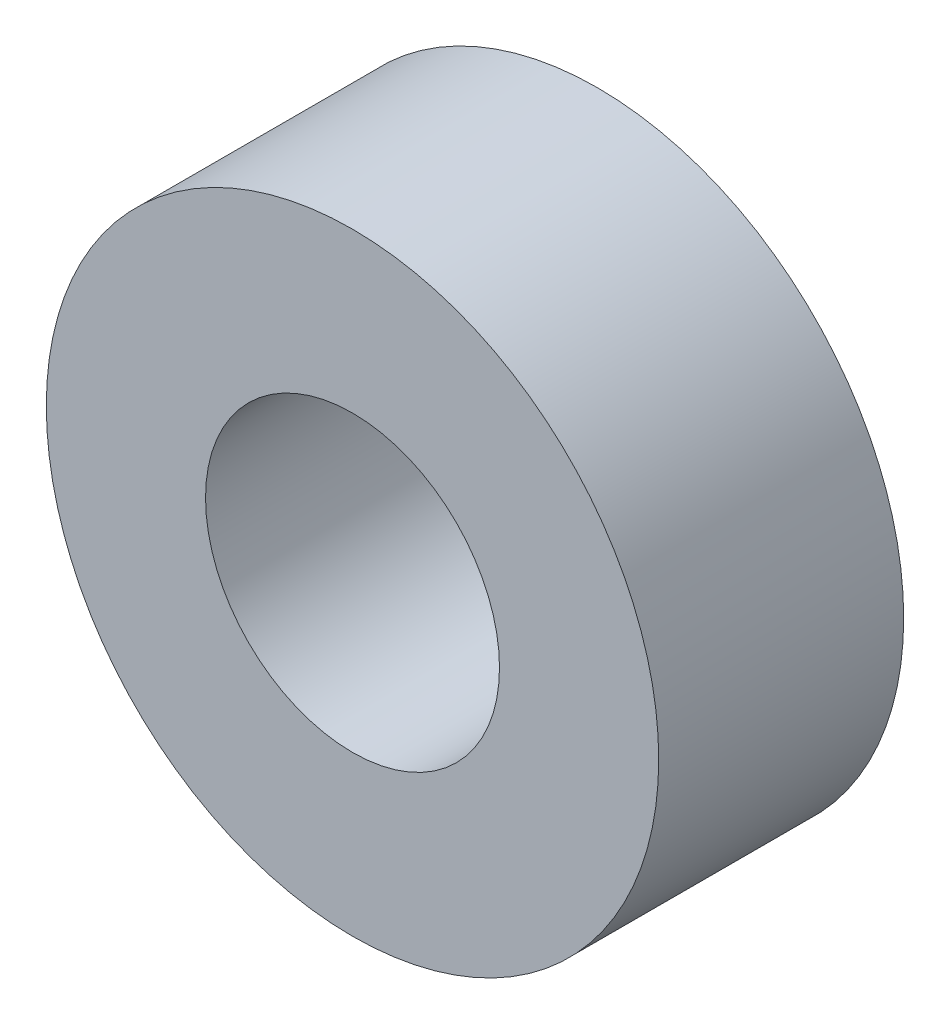
ISO-10303-21;
HEADER;
FILE_DESCRIPTION(('STEP AP214'),'2;1');
FILE_NAME('part.step','',(''),(''),'','','');
FILE_SCHEMA(('AUTOMOTIVE_DESIGN { 1 0 10303 214 1 1 1 1 }'));
ENDSEC;
DATA;
#1=APPLICATION_CONTEXT('core data for automotive mechanical design processes');
#2=APPLICATION_PROTOCOL_DEFINITION('international standard','automotive_design',2000,#1);
#3=PRODUCT_CONTEXT('',#1,'mechanical');
#4=PRODUCT('Part','Part','',(#3));
#5=PRODUCT_RELATED_PRODUCT_CATEGORY('part','',(#4));
#6=PRODUCT_DEFINITION_FORMATION('','',#4);
#7=PRODUCT_DEFINITION_CONTEXT('part definition',#1,'design');
#8=PRODUCT_DEFINITION('design','',#6,#7);
#9=PRODUCT_DEFINITION_SHAPE('','',#8);
#10=(LENGTH_UNIT() NAMED_UNIT(*) SI_UNIT(.MILLI.,.METRE.));
#11=(NAMED_UNIT(*) PLANE_ANGLE_UNIT() SI_UNIT($,.RADIAN.));
#12=(NAMED_UNIT(*) SI_UNIT($,.STERADIAN.) SOLID_ANGLE_UNIT());
#13=UNCERTAINTY_MEASURE_WITH_UNIT(LENGTH_MEASURE(1.E-05),#10,'distance_accuracy_value','');
#14=(GEOMETRIC_REPRESENTATION_CONTEXT(3) GLOBAL_UNCERTAINTY_ASSIGNED_CONTEXT((#13)) GLOBAL_UNIT_ASSIGNED_CONTEXT((#10,
#11,#12)) REPRESENTATION_CONTEXT('',''));
#15=CARTESIAN_POINT('',(0.,0.,0.));
#16=DIRECTION('',(0.,0.,1.));
#17=DIRECTION('',(1.,0.,0.));
#18=AXIS2_PLACEMENT_3D('',#15,#16,#17);
#19=CARTESIAN_POINT('',(0.,0.,5.));
#20=DIRECTION('',(0.,0.,1.));
#21=DIRECTION('',(1.,0.,0.));
#22=AXIS2_PLACEMENT_3D('',#19,#20,#21);
#23=PLANE('',#22);
#24=CARTESIAN_POINT('',(0.,0.,5.));
#25=DIRECTION('',(0.,0.,1.));
#26=DIRECTION('',(1.,0.,0.));
#27=AXIS2_PLACEMENT_3D('',#24,#25,#26);
#28=CIRCLE('',#27,6.25);
#29=CARTESIAN_POINT('',(6.25000000000003,0.,5.));
#30=VERTEX_POINT('',#29);
#31=EDGE_CURVE('E10',#30,#30,#28,.T.);
#32=ORIENTED_EDGE('',*,*,#31,.T.);
#33=EDGE_LOOP('',(#32));
#34=FACE_BOUND('',#33,.T.);
#35=CARTESIAN_POINT('',(0.,0.,5.));
#36=DIRECTION('',(0.,0.,1.));
#37=DIRECTION('',(1.,0.,0.));
#38=AXIS2_PLACEMENT_3D('',#35,#36,#37);
#39=CIRCLE('',#38,3.);
#40=CARTESIAN_POINT('',(3.00000000000001,0.,5.));
#41=VERTEX_POINT('',#40);
#42=EDGE_CURVE('E41',#41,#41,#39,.T.);
#43=ORIENTED_EDGE('',*,*,#42,.F.);
#44=EDGE_LOOP('',(#43));
#45=FACE_BOUND('',#44,.T.);
#46=ADVANCED_FACE('F30',(#34,#45),#23,.T.);
#47=CARTESIAN_POINT('',(0.,0.,0.));
#48=DIRECTION('',(0.,0.,1.));
#49=DIRECTION('',(1.,0.,0.));
#50=AXIS2_PLACEMENT_3D('',#47,#48,#49);
#51=PLANE('',#50);
#52=CARTESIAN_POINT('',(0.,0.,0.));
#53=DIRECTION('',(0.,0.,1.));
#54=DIRECTION('',(1.,0.,0.));
#55=AXIS2_PLACEMENT_3D('',#52,#53,#54);
#56=CIRCLE('',#55,6.25);
#57=CARTESIAN_POINT('',(6.25000000000003,0.,0.));
#58=VERTEX_POINT('',#57);
#59=EDGE_CURVE('E34',#58,#58,#56,.T.);
#60=ORIENTED_EDGE('',*,*,#59,.F.);
#61=EDGE_LOOP('',(#60));
#62=FACE_BOUND('',#61,.T.);
#63=CARTESIAN_POINT('',(0.,0.,0.));
#64=DIRECTION('',(0.,0.,1.));
#65=DIRECTION('',(1.,0.,0.));
#66=AXIS2_PLACEMENT_3D('',#63,#64,#65);
#67=CIRCLE('',#66,3.);
#68=CARTESIAN_POINT('',(3.00000000000001,0.,0.));
#69=VERTEX_POINT('',#68);
#70=EDGE_CURVE('E43',#69,#69,#67,.T.);
#71=ORIENTED_EDGE('',*,*,#70,.T.);
#72=EDGE_LOOP('',(#71));
#73=FACE_BOUND('',#72,.T.);
#74=ADVANCED_FACE('F53',(#62,#73),#51,.F.);
#75=CARTESIAN_POINT('',(0.,0.,5.));
#76=DIRECTION('',(0.,0.,-1.));
#77=DIRECTION('',(-1.,0.,0.));
#78=AXIS2_PLACEMENT_3D('',#75,#76,#77);
#79=CYLINDRICAL_SURFACE('',#78,6.25);
#80=ORIENTED_EDGE('',*,*,#31,.F.);
#81=EDGE_LOOP('',(#80));
#82=FACE_BOUND('',#81,.T.);
#83=ORIENTED_EDGE('',*,*,#59,.T.);
#84=EDGE_LOOP('',(#83));
#85=FACE_BOUND('',#84,.T.);
#86=ADVANCED_FACE('F32',(#82,#85),#79,.T.);
#87=CARTESIAN_POINT('',(0.,0.,5.));
#88=DIRECTION('',(0.,0.,-1.));
#89=DIRECTION('',(-1.,0.,0.));
#90=AXIS2_PLACEMENT_3D('',#87,#88,#89);
#91=CYLINDRICAL_SURFACE('',#90,3.);
#92=ORIENTED_EDGE('',*,*,#42,.T.);
#93=EDGE_LOOP('',(#92));
#94=FACE_BOUND('',#93,.T.);
#95=ORIENTED_EDGE('',*,*,#70,.F.);
#96=EDGE_LOOP('',(#95));
#97=FACE_BOUND('',#96,.T.);
#98=ADVANCED_FACE('F49',(#94,#97),#91,.F.);
#99=CLOSED_SHELL('',(#46,#74,#86,#98));
#100=MANIFOLD_SOLID_BREP('B2',#99);
#101=ADVANCED_BREP_SHAPE_REPRESENTATION('',(#18,#100),#14);
#102=SHAPE_DEFINITION_REPRESENTATION(#9,#101);
ENDSEC;
END-ISO-10303-21;
